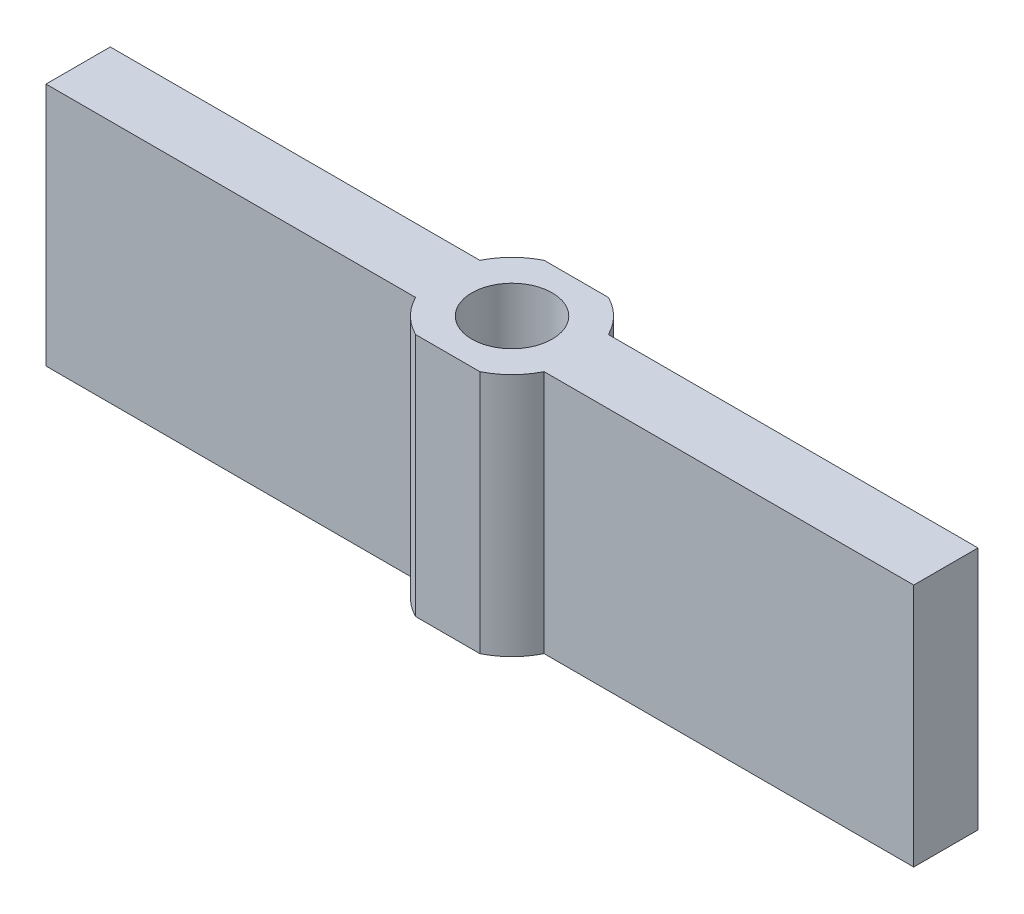
ISO-10303-21;
HEADER;
FILE_DESCRIPTION(('STEP AP214'),'2;1');
FILE_NAME('part.step','',(''),(''),'','','');
FILE_SCHEMA(('AUTOMOTIVE_DESIGN { 1 0 10303 214 1 1 1 1 }'));
ENDSEC;
DATA;
#1=APPLICATION_CONTEXT('core data for automotive mechanical design processes');
#2=APPLICATION_PROTOCOL_DEFINITION('international standard','automotive_design',2000,#1);
#3=PRODUCT_CONTEXT('',#1,'mechanical');
#4=PRODUCT('Part','Part','',(#3));
#5=PRODUCT_RELATED_PRODUCT_CATEGORY('part','',(#4));
#6=PRODUCT_DEFINITION_FORMATION('','',#4);
#7=PRODUCT_DEFINITION_CONTEXT('part definition',#1,'design');
#8=PRODUCT_DEFINITION('design','',#6,#7);
#9=PRODUCT_DEFINITION_SHAPE('','',#8);
#10=(LENGTH_UNIT() NAMED_UNIT(*) SI_UNIT(.MILLI.,.METRE.));
#11=(NAMED_UNIT(*) PLANE_ANGLE_UNIT() SI_UNIT($,.RADIAN.));
#12=(NAMED_UNIT(*) SI_UNIT($,.STERADIAN.) SOLID_ANGLE_UNIT());
#13=UNCERTAINTY_MEASURE_WITH_UNIT(LENGTH_MEASURE(1.E-05),#10,'distance_accuracy_value','');
#14=(GEOMETRIC_REPRESENTATION_CONTEXT(3) GLOBAL_UNCERTAINTY_ASSIGNED_CONTEXT((#13)) GLOBAL_UNIT_ASSIGNED_CONTEXT((#10,
#11,#12)) REPRESENTATION_CONTEXT('',''));
#15=CARTESIAN_POINT('',(0.,0.,0.));
#16=DIRECTION('',(0.,0.,1.));
#17=DIRECTION('',(1.,0.,0.));
#18=AXIS2_PLACEMENT_3D('',#15,#16,#17);
#19=CARTESIAN_POINT('',(0.,7.59999999999998,1.));
#20=DIRECTION('',(0.,1.,0.));
#21=DIRECTION('',(-1.,0.,0.));
#22=AXIS2_PLACEMENT_3D('',#19,#20,#21);
#23=PLANE('',#22);
#24=CARTESIAN_POINT('',(13.5,7.59999999999998,0.));
#25=DIRECTION('',(0.,1.,0.));
#26=DIRECTION('',(0.,0.,1.));
#27=AXIS2_PLACEMENT_3D('',#24,#25,#26);
#28=CIRCLE('',#27,1.25);
#29=CARTESIAN_POINT('',(13.5,7.59999999999998,1.25));
#30=VERTEX_POINT('',#29);
#31=EDGE_CURVE('E186',#30,#30,#28,.T.);
#32=ORIENTED_EDGE('',*,*,#31,.F.);
#33=EDGE_LOOP('',(#32));
#34=FACE_BOUND('',#33,.T.);
#35=DIRECTION('',(1.,0.,0.));
#36=VECTOR('',#35,1.);
#37=CARTESIAN_POINT('',(0.,7.59999999999998,-1.));
#38=LINE('',#37,#36);
#39=CARTESIAN_POINT('',(15.5,7.59999999999999,-1.));
#40=VERTEX_POINT('',#39);
#41=CARTESIAN_POINT('',(27.,7.59999999999999,-1.));
#42=VERTEX_POINT('',#41);
#43=EDGE_CURVE('E288',#40,#42,#38,.T.);
#44=ORIENTED_EDGE('',*,*,#43,.F.);
#45=CARTESIAN_POINT('',(13.5,7.59999999999998,0.));
#46=DIRECTION('',(0.,1.,0.));
#47=DIRECTION('',(0.,0.,1.));
#48=AXIS2_PLACEMENT_3D('',#45,#46,#47);
#49=CIRCLE('',#48,2.23606797749979);
#50=CARTESIAN_POINT('',(14.5,7.59999999999998,-2.));
#51=VERTEX_POINT('',#50);
#52=EDGE_CURVE('E276',#40,#51,#49,.T.);
#53=ORIENTED_EDGE('',*,*,#52,.T.);
#54=DIRECTION('',(1.,0.,0.));
#55=VECTOR('',#54,1.);
#56=CARTESIAN_POINT('',(0.,7.59999999999998,-2.));
#57=LINE('',#56,#55);
#58=CARTESIAN_POINT('',(12.5,7.59999999999999,-2.));
#59=VERTEX_POINT('',#58);
#60=EDGE_CURVE('E232',#59,#51,#57,.T.);
#61=ORIENTED_EDGE('',*,*,#60,.F.);
#62=CARTESIAN_POINT('',(13.5,7.59999999999998,0.));
#63=DIRECTION('',(0.,1.,0.));
#64=DIRECTION('',(0.,0.,1.));
#65=AXIS2_PLACEMENT_3D('',#62,#63,#64);
#66=CIRCLE('',#65,2.23606797749979);
#67=CARTESIAN_POINT('',(11.5,7.59999999999998,-1.));
#68=VERTEX_POINT('',#67);
#69=EDGE_CURVE('E104',#59,#68,#66,.T.);
#70=ORIENTED_EDGE('',*,*,#69,.T.);
#71=DIRECTION('',(1.,0.,0.));
#72=VECTOR('',#71,1.);
#73=CARTESIAN_POINT('',(0.,7.59999999999998,-1.));
#74=LINE('',#73,#72);
#75=CARTESIAN_POINT('',(0.,7.59999999999998,-1.));
#76=VERTEX_POINT('',#75);
#77=EDGE_CURVE('E250',#76,#68,#74,.T.);
#78=ORIENTED_EDGE('',*,*,#77,.F.);
#79=DIRECTION('',(0.,0.,-1.));
#80=VECTOR('',#79,1.);
#81=CARTESIAN_POINT('',(0.,7.59999999999998,1.));
#82=LINE('',#81,#80);
#83=CARTESIAN_POINT('',(0.,7.59999999999998,1.));
#84=VERTEX_POINT('',#83);
#85=EDGE_CURVE('E202',#84,#76,#82,.T.);
#86=ORIENTED_EDGE('',*,*,#85,.F.);
#87=DIRECTION('',(1.,0.,0.));
#88=VECTOR('',#87,1.);
#89=CARTESIAN_POINT('',(0.,7.59999999999998,1.));
#90=LINE('',#89,#88);
#91=CARTESIAN_POINT('',(11.5,7.59999999999998,1.));
#92=VERTEX_POINT('',#91);
#93=EDGE_CURVE('E193',#84,#92,#90,.T.);
#94=ORIENTED_EDGE('',*,*,#93,.T.);
#95=CARTESIAN_POINT('',(13.5,7.59999999999998,0.));
#96=DIRECTION('',(0.,1.,0.));
#97=DIRECTION('',(0.,0.,1.));
#98=AXIS2_PLACEMENT_3D('',#95,#96,#97);
#99=CIRCLE('',#98,2.23606797749979);
#100=CARTESIAN_POINT('',(12.5,7.59999999999998,2.));
#101=VERTEX_POINT('',#100);
#102=EDGE_CURVE('E176',#92,#101,#99,.T.);
#103=ORIENTED_EDGE('',*,*,#102,.T.);
#104=DIRECTION('',(1.,0.,0.));
#105=VECTOR('',#104,1.);
#106=CARTESIAN_POINT('',(0.,7.59999999999998,2.));
#107=LINE('',#106,#105);
#108=CARTESIAN_POINT('',(14.5,7.59999999999998,2.));
#109=VERTEX_POINT('',#108);
#110=EDGE_CURVE('E224',#101,#109,#107,.T.);
#111=ORIENTED_EDGE('',*,*,#110,.T.);
#112=CARTESIAN_POINT('',(13.5,7.59999999999998,0.));
#113=DIRECTION('',(0.,1.,0.));
#114=DIRECTION('',(0.,0.,1.));
#115=AXIS2_PLACEMENT_3D('',#112,#113,#114);
#116=CIRCLE('',#115,2.23606797749979);
#117=CARTESIAN_POINT('',(15.5,7.59999999999998,1.));
#118=VERTEX_POINT('',#117);
#119=EDGE_CURVE('E185',#109,#118,#116,.T.);
#120=ORIENTED_EDGE('',*,*,#119,.T.);
#121=DIRECTION('',(1.,0.,0.));
#122=VECTOR('',#121,1.);
#123=CARTESIAN_POINT('',(0.,7.59999999999998,1.));
#124=LINE('',#123,#122);
#125=CARTESIAN_POINT('',(27.,7.59999999999999,1.));
#126=VERTEX_POINT('',#125);
#127=EDGE_CURVE('E303',#118,#126,#124,.T.);
#128=ORIENTED_EDGE('',*,*,#127,.T.);
#129=DIRECTION('',(0.,0.,-1.));
#130=VECTOR('',#129,1.);
#131=CARTESIAN_POINT('',(27.,7.59999999999999,1.));
#132=LINE('',#131,#130);
#133=EDGE_CURVE('E317',#126,#42,#132,.T.);
#134=ORIENTED_EDGE('',*,*,#133,.T.);
#135=EDGE_LOOP('',(#44,#53,#61,#70,#78,#86,#94,#103,#111,#120,#128,#134));
#136=FACE_BOUND('',#135,.T.);
#137=ADVANCED_FACE('F89',(#34,#136),#23,.T.);
#138=CARTESIAN_POINT('',(0.,0.,1.));
#139=DIRECTION('',(0.,1.,0.));
#140=DIRECTION('',(-1.,0.,0.));
#141=AXIS2_PLACEMENT_3D('',#138,#139,#140);
#142=PLANE('',#141);
#143=CARTESIAN_POINT('',(13.5,0.,0.));
#144=DIRECTION('',(0.,1.,0.));
#145=DIRECTION('',(-1.,0.,0.));
#146=AXIS2_PLACEMENT_3D('',#143,#144,#145);
#147=CIRCLE('',#146,1.25);
#148=CARTESIAN_POINT('',(12.25,0.,0.));
#149=VERTEX_POINT('',#148);
#150=EDGE_CURVE('E92',#149,#149,#147,.T.);
#151=ORIENTED_EDGE('',*,*,#150,.T.);
#152=EDGE_LOOP('',(#151));
#153=FACE_BOUND('',#152,.T.);
#154=CARTESIAN_POINT('',(13.5,0.,0.));
#155=DIRECTION('',(0.,1.,0.));
#156=DIRECTION('',(-1.,0.,0.));
#157=AXIS2_PLACEMENT_3D('',#154,#155,#156);
#158=CIRCLE('',#157,2.23606797749979);
#159=CARTESIAN_POINT('',(15.5,0.,-1.));
#160=VERTEX_POINT('',#159);
#161=CARTESIAN_POINT('',(14.5,0.,-2.));
#162=VERTEX_POINT('',#161);
#163=EDGE_CURVE('E270',#160,#162,#158,.T.);
#164=ORIENTED_EDGE('',*,*,#163,.F.);
#165=DIRECTION('',(1.,0.,0.));
#166=VECTOR('',#165,1.);
#167=CARTESIAN_POINT('',(0.,0.,-1.));
#168=LINE('',#167,#166);
#169=CARTESIAN_POINT('',(27.,0.,-1.));
#170=VERTEX_POINT('',#169);
#171=EDGE_CURVE('E295',#160,#170,#168,.T.);
#172=ORIENTED_EDGE('',*,*,#171,.T.);
#173=DIRECTION('',(0.,0.,-1.));
#174=VECTOR('',#173,1.);
#175=CARTESIAN_POINT('',(27.,0.,1.));
#176=LINE('',#175,#174);
#177=CARTESIAN_POINT('',(27.,0.,1.));
#178=VERTEX_POINT('',#177);
#179=EDGE_CURVE('E239',#178,#170,#176,.T.);
#180=ORIENTED_EDGE('',*,*,#179,.F.);
#181=DIRECTION('',(1.,0.,0.));
#182=VECTOR('',#181,1.);
#183=CARTESIAN_POINT('',(0.,0.,1.));
#184=LINE('',#183,#182);
#185=CARTESIAN_POINT('',(15.5,0.,1.));
#186=VERTEX_POINT('',#185);
#187=EDGE_CURVE('E311',#186,#178,#184,.T.);
#188=ORIENTED_EDGE('',*,*,#187,.F.);
#189=CARTESIAN_POINT('',(13.5,0.,0.));
#190=DIRECTION('',(0.,1.,0.));
#191=DIRECTION('',(-1.,0.,0.));
#192=AXIS2_PLACEMENT_3D('',#189,#190,#191);
#193=CIRCLE('',#192,2.23606797749979);
#194=CARTESIAN_POINT('',(14.5,0.,2.));
#195=VERTEX_POINT('',#194);
#196=EDGE_CURVE('E230',#195,#186,#193,.T.);
#197=ORIENTED_EDGE('',*,*,#196,.F.);
#198=DIRECTION('',(1.,0.,0.));
#199=VECTOR('',#198,1.);
#200=CARTESIAN_POINT('',(0.,0.,2.));
#201=LINE('',#200,#199);
#202=CARTESIAN_POINT('',(12.5,0.,2.));
#203=VERTEX_POINT('',#202);
#204=EDGE_CURVE('E223',#203,#195,#201,.T.);
#205=ORIENTED_EDGE('',*,*,#204,.F.);
#206=CARTESIAN_POINT('',(13.5,0.,0.));
#207=DIRECTION('',(0.,1.,0.));
#208=DIRECTION('',(-1.,0.,0.));
#209=AXIS2_PLACEMENT_3D('',#206,#207,#208);
#210=CIRCLE('',#209,2.23606797749979);
#211=CARTESIAN_POINT('',(11.5,0.,1.));
#212=VERTEX_POINT('',#211);
#213=EDGE_CURVE('E112',#212,#203,#210,.T.);
#214=ORIENTED_EDGE('',*,*,#213,.F.);
#215=DIRECTION('',(1.,0.,0.));
#216=VECTOR('',#215,1.);
#217=CARTESIAN_POINT('',(0.,0.,1.));
#218=LINE('',#217,#216);
#219=CARTESIAN_POINT('',(0.,0.,1.));
#220=VERTEX_POINT('',#219);
#221=EDGE_CURVE('E196',#220,#212,#218,.T.);
#222=ORIENTED_EDGE('',*,*,#221,.F.);
#223=DIRECTION('',(0.,0.,-1.));
#224=VECTOR('',#223,1.);
#225=CARTESIAN_POINT('',(0.,0.,1.));
#226=LINE('',#225,#224);
#227=CARTESIAN_POINT('',(0.,0.,-1.));
#228=VERTEX_POINT('',#227);
#229=EDGE_CURVE('E212',#220,#228,#226,.T.);
#230=ORIENTED_EDGE('',*,*,#229,.T.);
#231=DIRECTION('',(1.,0.,0.));
#232=VECTOR('',#231,1.);
#233=CARTESIAN_POINT('',(0.,0.,-1.));
#234=LINE('',#233,#232);
#235=CARTESIAN_POINT('',(11.5,0.,-1.));
#236=VERTEX_POINT('',#235);
#237=EDGE_CURVE('E198',#228,#236,#234,.T.);
#238=ORIENTED_EDGE('',*,*,#237,.T.);
#239=CARTESIAN_POINT('',(13.5,0.,0.));
#240=DIRECTION('',(0.,1.,0.));
#241=DIRECTION('',(-1.,0.,0.));
#242=AXIS2_PLACEMENT_3D('',#239,#240,#241);
#243=CIRCLE('',#242,2.23606797749979);
#244=CARTESIAN_POINT('',(12.5,0.,-2.));
#245=VERTEX_POINT('',#244);
#246=EDGE_CURVE('E261',#245,#236,#243,.T.);
#247=ORIENTED_EDGE('',*,*,#246,.F.);
#248=DIRECTION('',(1.,0.,0.));
#249=VECTOR('',#248,1.);
#250=CARTESIAN_POINT('',(0.,0.,-2.));
#251=LINE('',#250,#249);
#252=EDGE_CURVE('E237',#245,#162,#251,.T.);
#253=ORIENTED_EDGE('',*,*,#252,.T.);
#254=EDGE_LOOP('',(#164,#172,#180,#188,#197,#205,#214,#222,#230,#238,#247,#253));
#255=FACE_BOUND('',#254,.T.);
#256=ADVANCED_FACE('F228',(#153,#255),#142,.F.);
#257=CARTESIAN_POINT('',(0.,0.,-2.));
#258=DIRECTION('',(0.,0.,1.));
#259=DIRECTION('',(1.,0.,0.));
#260=AXIS2_PLACEMENT_3D('',#257,#258,#259);
#261=PLANE('',#260);
#262=DIRECTION('',(0.,1.,0.));
#263=VECTOR('',#262,1.);
#264=CARTESIAN_POINT('',(14.5,-1.40000000000002,-2.));
#265=LINE('',#264,#263);
#266=EDGE_CURVE('E271',#162,#51,#265,.T.);
#267=ORIENTED_EDGE('',*,*,#266,.F.);
#268=ORIENTED_EDGE('',*,*,#252,.F.);
#269=DIRECTION('',(0.,1.,0.));
#270=VECTOR('',#269,1.);
#271=CARTESIAN_POINT('',(12.5,-1.40000000000002,-2.));
#272=LINE('',#271,#270);
#273=EDGE_CURVE('E12',#59,#245,#272,.F.);
#274=ORIENTED_EDGE('',*,*,#273,.F.);
#275=ORIENTED_EDGE('',*,*,#60,.T.);
#276=EDGE_LOOP('',(#267,#268,#274,#275));
#277=FACE_BOUND('',#276,.T.);
#278=ADVANCED_FACE('F352',(#277),#261,.F.);
#279=CARTESIAN_POINT('',(0.,0.,2.));
#280=DIRECTION('',(0.,0.,1.));
#281=DIRECTION('',(1.,0.,0.));
#282=AXIS2_PLACEMENT_3D('',#279,#280,#281);
#283=PLANE('',#282);
#284=ORIENTED_EDGE('',*,*,#204,.T.);
#285=DIRECTION('',(0.,1.,0.));
#286=VECTOR('',#285,1.);
#287=CARTESIAN_POINT('',(14.5,-1.40000000000002,2.));
#288=LINE('',#287,#286);
#289=EDGE_CURVE('E279',#195,#109,#288,.T.);
#290=ORIENTED_EDGE('',*,*,#289,.T.);
#291=ORIENTED_EDGE('',*,*,#110,.F.);
#292=DIRECTION('',(0.,1.,0.));
#293=VECTOR('',#292,1.);
#294=CARTESIAN_POINT('',(12.5,-1.40000000000002,2.));
#295=LINE('',#294,#293);
#296=EDGE_CURVE('E98',#101,#203,#295,.F.);
#297=ORIENTED_EDGE('',*,*,#296,.T.);
#298=EDGE_LOOP('',(#284,#290,#291,#297));
#299=FACE_BOUND('',#298,.T.);
#300=ADVANCED_FACE('F221',(#299),#283,.T.);
#301=CARTESIAN_POINT('',(0.,0.,1.));
#302=DIRECTION('',(-1.,0.,0.));
#303=DIRECTION('',(0.,-1.,0.));
#304=AXIS2_PLACEMENT_3D('',#301,#302,#303);
#305=PLANE('',#304);
#306=ORIENTED_EDGE('',*,*,#85,.T.);
#307=DIRECTION('',(0.,1.,0.));
#308=VECTOR('',#307,1.);
#309=CARTESIAN_POINT('',(0.,0.,-1.));
#310=LINE('',#309,#308);
#311=EDGE_CURVE('E254',#228,#76,#310,.T.);
#312=ORIENTED_EDGE('',*,*,#311,.F.);
#313=ORIENTED_EDGE('',*,*,#229,.F.);
#314=DIRECTION('',(0.,1.,0.));
#315=VECTOR('',#314,1.);
#316=CARTESIAN_POINT('',(0.,0.,1.));
#317=LINE('',#316,#315);
#318=EDGE_CURVE('E204',#220,#84,#317,.T.);
#319=ORIENTED_EDGE('',*,*,#318,.T.);
#320=EDGE_LOOP('',(#306,#312,#313,#319));
#321=FACE_BOUND('',#320,.T.);
#322=ADVANCED_FACE('F363',(#321),#305,.T.);
#323=CARTESIAN_POINT('',(0.,0.,1.));
#324=DIRECTION('',(0.,0.,1.));
#325=DIRECTION('',(1.,0.,0.));
#326=AXIS2_PLACEMENT_3D('',#323,#324,#325);
#327=PLANE('',#326);
#328=DIRECTION('',(0.,-1.,0.));
#329=VECTOR('',#328,1.);
#330=CARTESIAN_POINT('',(11.5,0.,1.));
#331=LINE('',#330,#329);
#332=EDGE_CURVE('E179',#92,#212,#331,.T.);
#333=ORIENTED_EDGE('',*,*,#332,.F.);
#334=ORIENTED_EDGE('',*,*,#93,.F.);
#335=ORIENTED_EDGE('',*,*,#318,.F.);
#336=ORIENTED_EDGE('',*,*,#221,.T.);
#337=EDGE_LOOP('',(#333,#334,#335,#336));
#338=FACE_BOUND('',#337,.T.);
#339=ADVANCED_FACE('F191',(#338),#327,.T.);
#340=CARTESIAN_POINT('',(0.,0.,-1.));
#341=DIRECTION('',(0.,0.,1.));
#342=DIRECTION('',(1.,0.,0.));
#343=AXIS2_PLACEMENT_3D('',#340,#341,#342);
#344=PLANE('',#343);
#345=DIRECTION('',(0.,-1.,0.));
#346=VECTOR('',#345,1.);
#347=CARTESIAN_POINT('',(11.5,0.,-1.));
#348=LINE('',#347,#346);
#349=EDGE_CURVE('E246',#68,#236,#348,.T.);
#350=ORIENTED_EDGE('',*,*,#349,.T.);
#351=ORIENTED_EDGE('',*,*,#237,.F.);
#352=ORIENTED_EDGE('',*,*,#311,.T.);
#353=ORIENTED_EDGE('',*,*,#77,.T.);
#354=EDGE_LOOP('',(#350,#351,#352,#353));
#355=FACE_BOUND('',#354,.T.);
#356=ADVANCED_FACE('F265',(#355),#344,.F.);
#357=CARTESIAN_POINT('',(27.,0.,1.));
#358=DIRECTION('',(-1.,0.,0.));
#359=DIRECTION('',(0.,-1.,0.));
#360=AXIS2_PLACEMENT_3D('',#357,#358,#359);
#361=PLANE('',#360);
#362=ORIENTED_EDGE('',*,*,#179,.T.);
#363=DIRECTION('',(0.,1.,0.));
#364=VECTOR('',#363,1.);
#365=CARTESIAN_POINT('',(27.,0.,-1.));
#366=LINE('',#365,#364);
#367=EDGE_CURVE('E299',#170,#42,#366,.T.);
#368=ORIENTED_EDGE('',*,*,#367,.T.);
#369=ORIENTED_EDGE('',*,*,#133,.F.);
#370=DIRECTION('',(0.,1.,0.));
#371=VECTOR('',#370,1.);
#372=CARTESIAN_POINT('',(27.,0.,1.));
#373=LINE('',#372,#371);
#374=EDGE_CURVE('E314',#178,#126,#373,.T.);
#375=ORIENTED_EDGE('',*,*,#374,.F.);
#376=EDGE_LOOP('',(#362,#368,#369,#375));
#377=FACE_BOUND('',#376,.T.);
#378=ADVANCED_FACE('F323',(#377),#361,.F.);
#379=CARTESIAN_POINT('',(0.,0.,1.));
#380=DIRECTION('',(0.,0.,1.));
#381=DIRECTION('',(1.,0.,0.));
#382=AXIS2_PLACEMENT_3D('',#379,#380,#381);
#383=PLANE('',#382);
#384=ORIENTED_EDGE('',*,*,#127,.F.);
#385=DIRECTION('',(0.,-1.,0.));
#386=VECTOR('',#385,1.);
#387=CARTESIAN_POINT('',(15.5,0.,1.));
#388=LINE('',#387,#386);
#389=EDGE_CURVE('E307',#118,#186,#388,.T.);
#390=ORIENTED_EDGE('',*,*,#389,.T.);
#391=ORIENTED_EDGE('',*,*,#187,.T.);
#392=ORIENTED_EDGE('',*,*,#374,.T.);
#393=EDGE_LOOP('',(#384,#390,#391,#392));
#394=FACE_BOUND('',#393,.T.);
#395=ADVANCED_FACE('F333',(#394),#383,.T.);
#396=CARTESIAN_POINT('',(0.,0.,-1.));
#397=DIRECTION('',(0.,0.,1.));
#398=DIRECTION('',(1.,0.,0.));
#399=AXIS2_PLACEMENT_3D('',#396,#397,#398);
#400=PLANE('',#399);
#401=ORIENTED_EDGE('',*,*,#43,.T.);
#402=ORIENTED_EDGE('',*,*,#367,.F.);
#403=ORIENTED_EDGE('',*,*,#171,.F.);
#404=DIRECTION('',(0.,-1.,0.));
#405=VECTOR('',#404,1.);
#406=CARTESIAN_POINT('',(15.5,0.,-1.));
#407=LINE('',#406,#405);
#408=EDGE_CURVE('E292',#40,#160,#407,.T.);
#409=ORIENTED_EDGE('',*,*,#408,.F.);
#410=EDGE_LOOP('',(#401,#402,#403,#409));
#411=FACE_BOUND('',#410,.T.);
#412=ADVANCED_FACE('F329',(#411),#400,.F.);
#413=CARTESIAN_POINT('',(13.5,-1.40000000000002,0.));
#414=DIRECTION('',(0.,1.,0.));
#415=DIRECTION('',(0.,0.,1.));
#416=AXIS2_PLACEMENT_3D('',#413,#414,#415);
#417=CYLINDRICAL_SURFACE('',#416,2.23606797749979);
#418=ORIENTED_EDGE('',*,*,#163,.T.);
#419=ORIENTED_EDGE('',*,*,#266,.T.);
#420=ORIENTED_EDGE('',*,*,#52,.F.);
#421=ORIENTED_EDGE('',*,*,#408,.T.);
#422=EDGE_LOOP('',(#418,#419,#420,#421));
#423=FACE_BOUND('',#422,.T.);
#424=ADVANCED_FACE('F385',(#423),#417,.T.);
#425=CARTESIAN_POINT('',(13.5,-1.40000000000002,0.));
#426=DIRECTION('',(0.,1.,0.));
#427=DIRECTION('',(0.,0.,1.));
#428=AXIS2_PLACEMENT_3D('',#425,#426,#427);
#429=CYLINDRICAL_SURFACE('',#428,2.23606797749979);
#430=ORIENTED_EDGE('',*,*,#196,.T.);
#431=ORIENTED_EDGE('',*,*,#389,.F.);
#432=ORIENTED_EDGE('',*,*,#119,.F.);
#433=ORIENTED_EDGE('',*,*,#289,.F.);
#434=EDGE_LOOP('',(#430,#431,#432,#433));
#435=FACE_BOUND('',#434,.T.);
#436=ADVANCED_FACE('F335',(#435),#429,.T.);
#437=CARTESIAN_POINT('',(13.5,-1.40000000000002,0.));
#438=DIRECTION('',(0.,1.,0.));
#439=DIRECTION('',(0.,0.,1.));
#440=AXIS2_PLACEMENT_3D('',#437,#438,#439);
#441=CYLINDRICAL_SURFACE('',#440,2.23606797749979);
#442=ORIENTED_EDGE('',*,*,#213,.T.);
#443=ORIENTED_EDGE('',*,*,#296,.F.);
#444=ORIENTED_EDGE('',*,*,#102,.F.);
#445=ORIENTED_EDGE('',*,*,#332,.T.);
#446=EDGE_LOOP('',(#442,#443,#444,#445));
#447=FACE_BOUND('',#446,.T.);
#448=ADVANCED_FACE('F178',(#447),#441,.T.);
#449=CARTESIAN_POINT('',(13.5,-1.40000000000002,0.));
#450=DIRECTION('',(0.,1.,0.));
#451=DIRECTION('',(0.,0.,1.));
#452=AXIS2_PLACEMENT_3D('',#449,#450,#451);
#453=CYLINDRICAL_SURFACE('',#452,2.23606797749979);
#454=ORIENTED_EDGE('',*,*,#246,.T.);
#455=ORIENTED_EDGE('',*,*,#349,.F.);
#456=ORIENTED_EDGE('',*,*,#69,.F.);
#457=ORIENTED_EDGE('',*,*,#273,.T.);
#458=EDGE_LOOP('',(#454,#455,#456,#457));
#459=FACE_BOUND('',#458,.T.);
#460=ADVANCED_FACE('F266',(#459),#453,.T.);
#461=CARTESIAN_POINT('',(13.5,-1.40000000000002,0.));
#462=DIRECTION('',(0.,1.,0.));
#463=DIRECTION('',(0.,0.,1.));
#464=AXIS2_PLACEMENT_3D('',#461,#462,#463);
#465=CYLINDRICAL_SURFACE('',#464,1.25);
#466=ORIENTED_EDGE('',*,*,#31,.T.);
#467=EDGE_LOOP('',(#466));
#468=FACE_BOUND('',#467,.T.);
#469=ORIENTED_EDGE('',*,*,#150,.F.);
#470=EDGE_LOOP('',(#469));
#471=FACE_BOUND('',#470,.T.);
#472=ADVANCED_FACE('F345',(#468,#471),#465,.F.);
#473=CLOSED_SHELL('',(#137,#256,#278,#300,#322,#339,#356,#378,#395,#412,#424,#436,#448,#460,#472));
#474=MANIFOLD_SOLID_BREP('B2',#473);
#475=ADVANCED_BREP_SHAPE_REPRESENTATION('',(#18,#474),#14);
#476=SHAPE_DEFINITION_REPRESENTATION(#9,#475);
ENDSEC;
END-ISO-10303-21;
